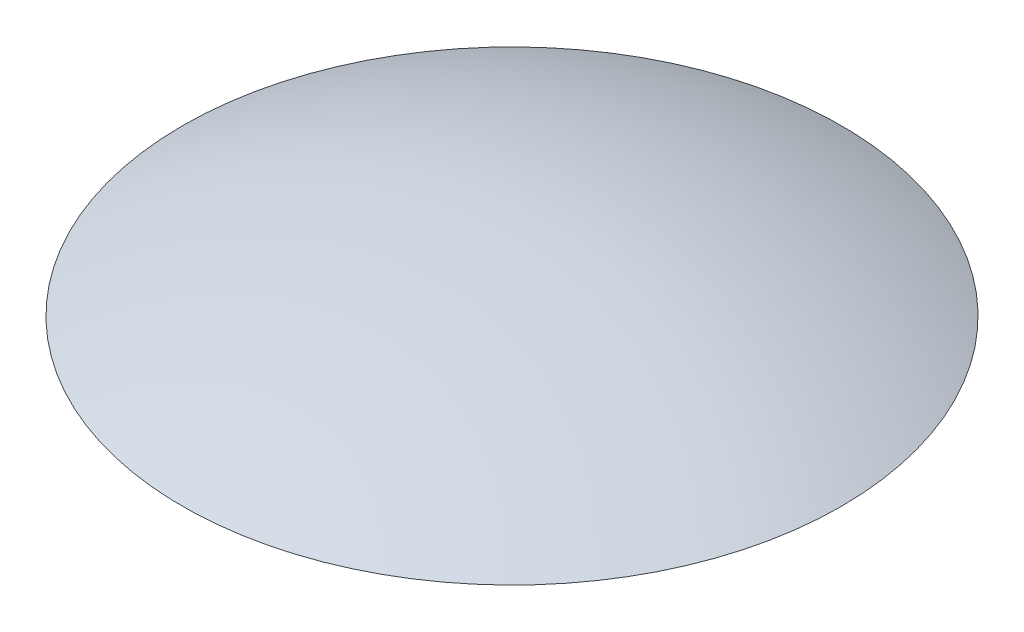
ISO-10303-21;
HEADER;
FILE_DESCRIPTION(('STEP AP214'),'2;1');
FILE_NAME('part.step','',(''),(''),'','','');
FILE_SCHEMA(('AUTOMOTIVE_DESIGN { 1 0 10303 214 1 1 1 1 }'));
ENDSEC;
DATA;
#1=APPLICATION_CONTEXT('core data for automotive mechanical design processes');
#2=APPLICATION_PROTOCOL_DEFINITION('international standard','automotive_design',2000,#1);
#3=PRODUCT_CONTEXT('',#1,'mechanical');
#4=PRODUCT('Part','Part','',(#3));
#5=PRODUCT_RELATED_PRODUCT_CATEGORY('part','',(#4));
#6=PRODUCT_DEFINITION_FORMATION('','',#4);
#7=PRODUCT_DEFINITION_CONTEXT('part definition',#1,'design');
#8=PRODUCT_DEFINITION('design','',#6,#7);
#9=PRODUCT_DEFINITION_SHAPE('','',#8);
#10=(LENGTH_UNIT() NAMED_UNIT(*) SI_UNIT(.MILLI.,.METRE.));
#11=(NAMED_UNIT(*) PLANE_ANGLE_UNIT() SI_UNIT($,.RADIAN.));
#12=(NAMED_UNIT(*) SI_UNIT($,.STERADIAN.) SOLID_ANGLE_UNIT());
#13=UNCERTAINTY_MEASURE_WITH_UNIT(LENGTH_MEASURE(1.E-05),#10,'distance_accuracy_value','');
#14=(GEOMETRIC_REPRESENTATION_CONTEXT(3) GLOBAL_UNCERTAINTY_ASSIGNED_CONTEXT((#13)) GLOBAL_UNIT_ASSIGNED_CONTEXT((#10,
#11,#12)) REPRESENTATION_CONTEXT('',''));
#15=CARTESIAN_POINT('',(0.,0.,0.));
#16=DIRECTION('',(0.,0.,1.));
#17=DIRECTION('',(1.,0.,0.));
#18=AXIS2_PLACEMENT_3D('',#15,#16,#17);
#19=CARTESIAN_POINT('',(0.,-135.,0.));
#20=DIRECTION('',(0.,1.,0.));
#21=DIRECTION('',(1.,0.,0.));
#22=AXIS2_PLACEMENT_3D('',#19,#20,#21);
#23=SPHERICAL_SURFACE('',#22,150.);
#24=CARTESIAN_POINT('',(0.,0.,0.));
#25=DIRECTION('',(0.,1.,0.));
#26=DIRECTION('',(-1.,0.,0.));
#27=AXIS2_PLACEMENT_3D('',#24,#25,#26);
#28=CIRCLE('',#27,65.3834841531101);
#29=CARTESIAN_POINT('',(-65.3834841531101,0.,0.));
#30=VERTEX_POINT('',#29);
#31=EDGE_CURVE('E10',#30,#30,#28,.T.);
#32=ORIENTED_EDGE('',*,*,#31,.T.);
#33=EDGE_LOOP('',(#32));
#34=FACE_BOUND('',#33,.T.);
#35=ADVANCED_FACE('F31',(#34),#23,.T.);
#36=CARTESIAN_POINT('',(0.,0.,0.));
#37=DIRECTION('',(0.,1.,0.));
#38=DIRECTION('',(-1.,0.,0.));
#39=AXIS2_PLACEMENT_3D('',#36,#37,#38);
#40=PLANE('',#39);
#41=CARTESIAN_POINT('',(-17.4999999999997,0.,30.3108891324555));
#42=DIRECTION('',(0.,-1.,0.));
#43=DIRECTION('',(-0.499999999999992,0.,0.866025403784443));
#44=AXIS2_PLACEMENT_3D('',#41,#42,#43);
#45=CIRCLE('',#44,10.);
#46=CARTESIAN_POINT('',(-22.4999999999996,0.,38.9711431703));
#47=VERTEX_POINT('',#46);
#48=EDGE_CURVE('E60',#47,#47,#45,.T.);
#49=ORIENTED_EDGE('',*,*,#48,.F.);
#50=EDGE_LOOP('',(#49));
#51=FACE_BOUND('',#50,.T.);
#52=CARTESIAN_POINT('',(-17.5000000000001,0.,-30.3108891324553));
#53=DIRECTION('',(0.,-1.,0.));
#54=DIRECTION('',(-0.500000000000004,0.,-0.866025403784436));
#55=AXIS2_PLACEMENT_3D('',#52,#53,#54);
#56=CIRCLE('',#55,10.);
#57=CARTESIAN_POINT('',(-22.5000000000002,0.,-38.9711431702996));
#58=VERTEX_POINT('',#57);
#59=EDGE_CURVE('E54',#58,#58,#56,.T.);
#60=ORIENTED_EDGE('',*,*,#59,.F.);
#61=EDGE_LOOP('',(#60));
#62=FACE_BOUND('',#61,.T.);
#63=CARTESIAN_POINT('',(35.,0.,0.));
#64=DIRECTION('',(0.,-1.,0.));
#65=DIRECTION('',(1.,0.,0.));
#66=AXIS2_PLACEMENT_3D('',#63,#64,#65);
#67=CIRCLE('',#66,10.);
#68=CARTESIAN_POINT('',(45.,0.,0.));
#69=VERTEX_POINT('',#68);
#70=EDGE_CURVE('E48',#69,#69,#67,.T.);
#71=ORIENTED_EDGE('',*,*,#70,.F.);
#72=EDGE_LOOP('',(#71));
#73=FACE_BOUND('',#72,.T.);
#74=CARTESIAN_POINT('',(0.,0.,0.));
#75=DIRECTION('',(0.,-1.,0.));
#76=DIRECTION('',(1.,0.,0.));
#77=AXIS2_PLACEMENT_3D('',#74,#75,#76);
#78=CIRCLE('',#77,10.25);
#79=CARTESIAN_POINT('',(10.25,0.,0.));
#80=VERTEX_POINT('',#79);
#81=EDGE_CURVE('E41',#80,#80,#78,.T.);
#82=ORIENTED_EDGE('',*,*,#81,.F.);
#83=EDGE_LOOP('',(#82));
#84=FACE_BOUND('',#83,.T.);
#85=ORIENTED_EDGE('',*,*,#31,.F.);
#86=EDGE_LOOP('',(#85));
#87=FACE_BOUND('',#86,.T.);
#88=ADVANCED_FACE('F75',(#51,#62,#73,#84,#87),#40,.F.);
#89=CARTESIAN_POINT('',(0.,11.65,0.));
#90=DIRECTION('',(0.,-1.,0.));
#91=DIRECTION('',(1.,0.,0.));
#92=AXIS2_PLACEMENT_3D('',#89,#90,#91);
#93=CYLINDRICAL_SURFACE('',#92,10.25);
#94=CARTESIAN_POINT('',(0.,11.65,0.));
#95=DIRECTION('',(0.,-1.,0.));
#96=DIRECTION('',(1.,0.,0.));
#97=AXIS2_PLACEMENT_3D('',#94,#95,#96);
#98=CIRCLE('',#97,10.25);
#99=CARTESIAN_POINT('',(10.25,11.65,0.));
#100=VERTEX_POINT('',#99);
#101=EDGE_CURVE('E37',#100,#100,#98,.T.);
#102=ORIENTED_EDGE('',*,*,#101,.F.);
#103=EDGE_LOOP('',(#102));
#104=FACE_BOUND('',#103,.T.);
#105=ORIENTED_EDGE('',*,*,#81,.T.);
#106=EDGE_LOOP('',(#105));
#107=FACE_BOUND('',#106,.T.);
#108=ADVANCED_FACE('F78',(#104,#107),#93,.F.);
#109=CARTESIAN_POINT('',(0.,11.65,0.));
#110=DIRECTION('',(0.,-1.,0.));
#111=DIRECTION('',(1.,0.,0.));
#112=AXIS2_PLACEMENT_3D('',#109,#110,#111);
#113=PLANE('',#112);
#114=ORIENTED_EDGE('',*,*,#101,.T.);
#115=EDGE_LOOP('',(#114));
#116=FACE_BOUND('',#115,.T.);
#117=ADVANCED_FACE('F87',(#116),#113,.T.);
#118=CARTESIAN_POINT('',(35.,6.,0.));
#119=DIRECTION('',(0.,-1.,0.));
#120=DIRECTION('',(1.,0.,0.));
#121=AXIS2_PLACEMENT_3D('',#118,#119,#120);
#122=CYLINDRICAL_SURFACE('',#121,10.);
#123=CARTESIAN_POINT('',(35.,6.,0.));
#124=DIRECTION('',(0.,-1.,0.));
#125=DIRECTION('',(1.,0.,0.));
#126=AXIS2_PLACEMENT_3D('',#123,#124,#125);
#127=CIRCLE('',#126,10.);
#128=CARTESIAN_POINT('',(45.,6.,0.));
#129=VERTEX_POINT('',#128);
#130=EDGE_CURVE('E46',#129,#129,#127,.T.);
#131=ORIENTED_EDGE('',*,*,#130,.F.);
#132=EDGE_LOOP('',(#131));
#133=FACE_BOUND('',#132,.T.);
#134=ORIENTED_EDGE('',*,*,#70,.T.);
#135=EDGE_LOOP('',(#134));
#136=FACE_BOUND('',#135,.T.);
#137=ADVANCED_FACE('F93',(#133,#136),#122,.F.);
#138=CARTESIAN_POINT('',(35.,6.,0.));
#139=DIRECTION('',(0.,-1.,0.));
#140=DIRECTION('',(1.,0.,0.));
#141=AXIS2_PLACEMENT_3D('',#138,#139,#140);
#142=PLANE('',#141);
#143=ORIENTED_EDGE('',*,*,#130,.T.);
#144=EDGE_LOOP('',(#143));
#145=FACE_BOUND('',#144,.T.);
#146=ADVANCED_FACE('F109',(#145),#142,.T.);
#147=CARTESIAN_POINT('',(-17.5000000000001,6.,-30.3108891324553));
#148=DIRECTION('',(0.,-1.,0.));
#149=DIRECTION('',(1.,0.,0.));
#150=AXIS2_PLACEMENT_3D('',#147,#148,#149);
#151=CYLINDRICAL_SURFACE('',#150,10.);
#152=CARTESIAN_POINT('',(-17.5000000000001,6.,-30.3108891324553));
#153=DIRECTION('',(0.,-1.,0.));
#154=DIRECTION('',(-0.500000000000004,0.,-0.866025403784436));
#155=AXIS2_PLACEMENT_3D('',#152,#153,#154);
#156=CIRCLE('',#155,10.);
#157=CARTESIAN_POINT('',(-22.5000000000002,6.,-38.9711431702996));
#158=VERTEX_POINT('',#157);
#159=EDGE_CURVE('E51',#158,#158,#156,.T.);
#160=ORIENTED_EDGE('',*,*,#159,.F.);
#161=EDGE_LOOP('',(#160));
#162=FACE_BOUND('',#161,.T.);
#163=ORIENTED_EDGE('',*,*,#59,.T.);
#164=EDGE_LOOP('',(#163));
#165=FACE_BOUND('',#164,.T.);
#166=ADVANCED_FACE('F114',(#162,#165),#151,.F.);
#167=CARTESIAN_POINT('',(-17.5000000000001,6.,-30.3108891324553));
#168=DIRECTION('',(0.,-1.,0.));
#169=DIRECTION('',(-0.500000000000004,0.,-0.866025403784436));
#170=AXIS2_PLACEMENT_3D('',#167,#168,#169);
#171=PLANE('',#170);
#172=ORIENTED_EDGE('',*,*,#159,.T.);
#173=EDGE_LOOP('',(#172));
#174=FACE_BOUND('',#173,.T.);
#175=ADVANCED_FACE('F71',(#174),#171,.T.);
#176=CARTESIAN_POINT('',(-17.4999999999997,6.,30.3108891324555));
#177=DIRECTION('',(0.,-1.,0.));
#178=DIRECTION('',(1.,0.,0.));
#179=AXIS2_PLACEMENT_3D('',#176,#177,#178);
#180=CYLINDRICAL_SURFACE('',#179,10.);
#181=CARTESIAN_POINT('',(-17.4999999999997,6.,30.3108891324555));
#182=DIRECTION('',(0.,-1.,0.));
#183=DIRECTION('',(-0.499999999999992,0.,0.866025403784443));
#184=AXIS2_PLACEMENT_3D('',#181,#182,#183);
#185=CIRCLE('',#184,10.);
#186=CARTESIAN_POINT('',(-22.4999999999996,6.,38.9711431703));
#187=VERTEX_POINT('',#186);
#188=EDGE_CURVE('E57',#187,#187,#185,.T.);
#189=ORIENTED_EDGE('',*,*,#188,.F.);
#190=EDGE_LOOP('',(#189));
#191=FACE_BOUND('',#190,.T.);
#192=ORIENTED_EDGE('',*,*,#48,.T.);
#193=EDGE_LOOP('',(#192));
#194=FACE_BOUND('',#193,.T.);
#195=ADVANCED_FACE('F68',(#191,#194),#180,.F.);
#196=CARTESIAN_POINT('',(-17.4999999999997,6.,30.3108891324555));
#197=DIRECTION('',(0.,-1.,0.));
#198=DIRECTION('',(-0.499999999999992,0.,0.866025403784443));
#199=AXIS2_PLACEMENT_3D('',#196,#197,#198);
#200=PLANE('',#199);
#201=ORIENTED_EDGE('',*,*,#188,.T.);
#202=EDGE_LOOP('',(#201));
#203=FACE_BOUND('',#202,.T.);
#204=ADVANCED_FACE('F66',(#203),#200,.T.);
#205=CLOSED_SHELL('',(#35,#88,#108,#117,#137,#146,#166,#175,#195,#204));
#206=MANIFOLD_SOLID_BREP('B2',#205);
#207=ADVANCED_BREP_SHAPE_REPRESENTATION('',(#18,#206),#14);
#208=SHAPE_DEFINITION_REPRESENTATION(#9,#207);
ENDSEC;
END-ISO-10303-21;
